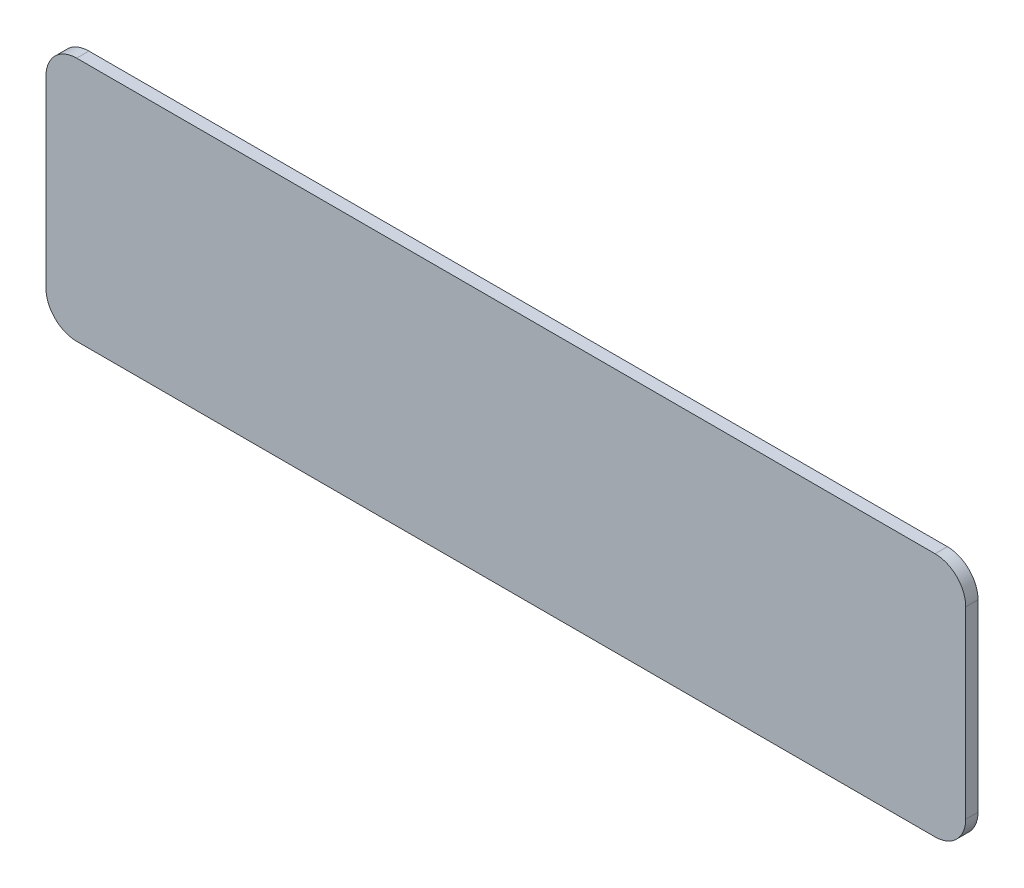
ISO-10303-21;
HEADER;
FILE_DESCRIPTION(('STEP AP214'),'2;1');
FILE_NAME('part.step','',(''),(''),'','','');
FILE_SCHEMA(('AUTOMOTIVE_DESIGN { 1 0 10303 214 1 1 1 1 }'));
ENDSEC;
DATA;
#1=APPLICATION_CONTEXT('core data for automotive mechanical design processes');
#2=APPLICATION_PROTOCOL_DEFINITION('international standard','automotive_design',2000,#1);
#3=PRODUCT_CONTEXT('',#1,'mechanical');
#4=PRODUCT('Part','Part','',(#3));
#5=PRODUCT_RELATED_PRODUCT_CATEGORY('part','',(#4));
#6=PRODUCT_DEFINITION_FORMATION('','',#4);
#7=PRODUCT_DEFINITION_CONTEXT('part definition',#1,'design');
#8=PRODUCT_DEFINITION('design','',#6,#7);
#9=PRODUCT_DEFINITION_SHAPE('','',#8);
#10=(LENGTH_UNIT() NAMED_UNIT(*) SI_UNIT(.MILLI.,.METRE.));
#11=(NAMED_UNIT(*) PLANE_ANGLE_UNIT() SI_UNIT($,.RADIAN.));
#12=(NAMED_UNIT(*) SI_UNIT($,.STERADIAN.) SOLID_ANGLE_UNIT());
#13=UNCERTAINTY_MEASURE_WITH_UNIT(LENGTH_MEASURE(1.E-05),#10,'distance_accuracy_value','');
#14=(GEOMETRIC_REPRESENTATION_CONTEXT(3) GLOBAL_UNCERTAINTY_ASSIGNED_CONTEXT((#13)) GLOBAL_UNIT_ASSIGNED_CONTEXT((#10,
#11,#12)) REPRESENTATION_CONTEXT('',''));
#15=CARTESIAN_POINT('',(0.,0.,0.));
#16=DIRECTION('',(0.,0.,1.));
#17=DIRECTION('',(1.,0.,0.));
#18=AXIS2_PLACEMENT_3D('',#15,#16,#17);
#19=CARTESIAN_POINT('',(80.5012762868845,0.,1.));
#20=DIRECTION('',(-1.,0.,0.));
#21=DIRECTION('',(0.,0.,1.));
#22=AXIS2_PLACEMENT_3D('',#19,#20,#21);
#23=PLANE('',#22);
#24=DIRECTION('',(0.,1.,0.));
#25=VECTOR('',#24,1.);
#26=CARTESIAN_POINT('',(80.5012762868845,0.,-1.));
#27=LINE('',#26,#25);
#28=CARTESIAN_POINT('',(80.5012762868845,-14.1165005815671,-1.));
#29=VERTEX_POINT('',#28);
#30=CARTESIAN_POINT('',(80.5012762868845,15.8834994184329,-1.));
#31=VERTEX_POINT('',#30);
#32=EDGE_CURVE('E134',#29,#31,#27,.T.);
#33=ORIENTED_EDGE('',*,*,#32,.T.);
#34=DIRECTION('',(0.,0.,-1.));
#35=VECTOR('',#34,1.);
#36=CARTESIAN_POINT('',(80.5012762868845,15.8834994184329,1.));
#37=LINE('',#36,#35);
#38=CARTESIAN_POINT('',(80.5012762868845,15.8834994184329,1.));
#39=VERTEX_POINT('',#38);
#40=EDGE_CURVE('E11',#39,#31,#37,.T.);
#41=ORIENTED_EDGE('',*,*,#40,.F.);
#42=DIRECTION('',(0.,1.,0.));
#43=VECTOR('',#42,1.);
#44=CARTESIAN_POINT('',(80.5012762868845,0.,1.));
#45=LINE('',#44,#43);
#46=CARTESIAN_POINT('',(80.5012762868845,-14.1165005815671,1.));
#47=VERTEX_POINT('',#46);
#48=EDGE_CURVE('E154',#47,#39,#45,.T.);
#49=ORIENTED_EDGE('',*,*,#48,.F.);
#50=DIRECTION('',(0.,0.,-1.));
#51=VECTOR('',#50,1.);
#52=CARTESIAN_POINT('',(80.5012762868845,-14.1165005815671,1.));
#53=LINE('',#52,#51);
#54=EDGE_CURVE('E53',#47,#29,#53,.T.);
#55=ORIENTED_EDGE('',*,*,#54,.T.);
#56=EDGE_LOOP('',(#33,#41,#49,#55));
#57=FACE_BOUND('',#56,.T.);
#58=ADVANCED_FACE('F37',(#57),#23,.F.);
#59=CARTESIAN_POINT('',(75.5012762868844,15.8834994184329,1.));
#60=DIRECTION('',(0.,0.,-1.));
#61=DIRECTION('',(-1.,0.,0.));
#62=AXIS2_PLACEMENT_3D('',#59,#60,#61);
#63=CYLINDRICAL_SURFACE('',#62,5.);
#64=CARTESIAN_POINT('',(75.5012762868844,15.8834994184329,-1.));
#65=DIRECTION('',(0.,0.,1.));
#66=DIRECTION('',(1.,0.,0.));
#67=AXIS2_PLACEMENT_3D('',#64,#65,#66);
#68=CIRCLE('',#67,5.);
#69=CARTESIAN_POINT('',(75.5012762868844,20.8834994184329,-1.));
#70=VERTEX_POINT('',#69);
#71=EDGE_CURVE('E136',#31,#70,#68,.T.);
#72=ORIENTED_EDGE('',*,*,#71,.T.);
#73=DIRECTION('',(0.,0.,-1.));
#74=VECTOR('',#73,1.);
#75=CARTESIAN_POINT('',(75.5012762868844,20.8834994184329,1.));
#76=LINE('',#75,#74);
#77=CARTESIAN_POINT('',(75.5012762868844,20.8834994184329,1.));
#78=VERTEX_POINT('',#77);
#79=EDGE_CURVE('E45',#78,#70,#76,.T.);
#80=ORIENTED_EDGE('',*,*,#79,.F.);
#81=CARTESIAN_POINT('',(75.5012762868844,15.8834994184329,1.));
#82=DIRECTION('',(0.,0.,1.));
#83=DIRECTION('',(1.,0.,0.));
#84=AXIS2_PLACEMENT_3D('',#81,#82,#83);
#85=CIRCLE('',#84,5.);
#86=EDGE_CURVE('E91',#39,#78,#85,.T.);
#87=ORIENTED_EDGE('',*,*,#86,.F.);
#88=ORIENTED_EDGE('',*,*,#40,.T.);
#89=EDGE_LOOP('',(#72,#80,#87,#88));
#90=FACE_BOUND('',#89,.T.);
#91=ADVANCED_FACE('F167',(#90),#63,.T.);
#92=CARTESIAN_POINT('',(0.,20.8834994184329,1.));
#93=DIRECTION('',(0.,1.,0.));
#94=DIRECTION('',(0.,0.,1.));
#95=AXIS2_PLACEMENT_3D('',#92,#93,#94);
#96=PLANE('',#95);
#97=DIRECTION('',(1.,0.,0.));
#98=VECTOR('',#97,1.);
#99=CARTESIAN_POINT('',(0.,20.8834994184329,-1.));
#100=LINE('',#99,#98);
#101=CARTESIAN_POINT('',(-64.4987237131155,20.8834994184329,-1.));
#102=VERTEX_POINT('',#101);
#103=EDGE_CURVE('E139',#102,#70,#100,.T.);
#104=ORIENTED_EDGE('',*,*,#103,.F.);
#105=DIRECTION('',(0.,0.,-1.));
#106=VECTOR('',#105,1.);
#107=CARTESIAN_POINT('',(-64.4987237131155,20.8834994184329,1.));
#108=LINE('',#107,#106);
#109=CARTESIAN_POINT('',(-64.4987237131155,20.8834994184329,1.));
#110=VERTEX_POINT('',#109);
#111=EDGE_CURVE('E160',#110,#102,#108,.T.);
#112=ORIENTED_EDGE('',*,*,#111,.F.);
#113=DIRECTION('',(1.,0.,0.));
#114=VECTOR('',#113,1.);
#115=CARTESIAN_POINT('',(0.,20.8834994184329,1.));
#116=LINE('',#115,#114);
#117=EDGE_CURVE('E166',#110,#78,#116,.T.);
#118=ORIENTED_EDGE('',*,*,#117,.T.);
#119=ORIENTED_EDGE('',*,*,#79,.T.);
#120=EDGE_LOOP('',(#104,#112,#118,#119));
#121=FACE_BOUND('',#120,.T.);
#122=ADVANCED_FACE('F164',(#121),#96,.T.);
#123=CARTESIAN_POINT('',(-64.4987237131155,15.8834994184329,1.));
#124=DIRECTION('',(0.,0.,-1.));
#125=DIRECTION('',(-1.,0.,0.));
#126=AXIS2_PLACEMENT_3D('',#123,#124,#125);
#127=CYLINDRICAL_SURFACE('',#126,5.);
#128=CARTESIAN_POINT('',(-64.4987237131155,15.8834994184329,-1.));
#129=DIRECTION('',(0.,0.,1.));
#130=DIRECTION('',(1.,0.,0.));
#131=AXIS2_PLACEMENT_3D('',#128,#129,#130);
#132=CIRCLE('',#131,5.);
#133=CARTESIAN_POINT('',(-69.4987237131155,15.8834994184329,-1.));
#134=VERTEX_POINT('',#133);
#135=EDGE_CURVE('E142',#134,#102,#132,.F.);
#136=ORIENTED_EDGE('',*,*,#135,.F.);
#137=DIRECTION('',(0.,0.,-1.));
#138=VECTOR('',#137,1.);
#139=CARTESIAN_POINT('',(-69.4987237131155,15.8834994184329,1.));
#140=LINE('',#139,#138);
#141=CARTESIAN_POINT('',(-69.4987237131155,15.8834994184329,1.));
#142=VERTEX_POINT('',#141);
#143=EDGE_CURVE('E158',#142,#134,#140,.T.);
#144=ORIENTED_EDGE('',*,*,#143,.F.);
#145=CARTESIAN_POINT('',(-64.4987237131155,15.8834994184329,1.));
#146=DIRECTION('',(0.,0.,1.));
#147=DIRECTION('',(1.,0.,0.));
#148=AXIS2_PLACEMENT_3D('',#145,#146,#147);
#149=CIRCLE('',#148,5.);
#150=EDGE_CURVE('E176',#142,#110,#149,.F.);
#151=ORIENTED_EDGE('',*,*,#150,.T.);
#152=ORIENTED_EDGE('',*,*,#111,.T.);
#153=EDGE_LOOP('',(#136,#144,#151,#152));
#154=FACE_BOUND('',#153,.T.);
#155=ADVANCED_FACE('F174',(#154),#127,.T.);
#156=CARTESIAN_POINT('',(-69.4987237131155,0.,1.));
#157=DIRECTION('',(-1.,0.,0.));
#158=DIRECTION('',(0.,0.,1.));
#159=AXIS2_PLACEMENT_3D('',#156,#157,#158);
#160=PLANE('',#159);
#161=DIRECTION('',(0.,1.,0.));
#162=VECTOR('',#161,1.);
#163=CARTESIAN_POINT('',(-69.4987237131155,0.,-1.));
#164=LINE('',#163,#162);
#165=CARTESIAN_POINT('',(-69.4987237131155,-14.1165005815671,-1.));
#166=VERTEX_POINT('',#165);
#167=EDGE_CURVE('E145',#166,#134,#164,.T.);
#168=ORIENTED_EDGE('',*,*,#167,.F.);
#169=DIRECTION('',(0.,0.,-1.));
#170=VECTOR('',#169,1.);
#171=CARTESIAN_POINT('',(-69.4987237131155,-14.1165005815671,1.));
#172=LINE('',#171,#170);
#173=CARTESIAN_POINT('',(-69.4987237131155,-14.1165005815671,1.));
#174=VERTEX_POINT('',#173);
#175=EDGE_CURVE('E116',#174,#166,#172,.T.);
#176=ORIENTED_EDGE('',*,*,#175,.F.);
#177=DIRECTION('',(0.,1.,0.));
#178=VECTOR('',#177,1.);
#179=CARTESIAN_POINT('',(-69.4987237131155,0.,1.));
#180=LINE('',#179,#178);
#181=EDGE_CURVE('E126',#174,#142,#180,.T.);
#182=ORIENTED_EDGE('',*,*,#181,.T.);
#183=ORIENTED_EDGE('',*,*,#143,.T.);
#184=EDGE_LOOP('',(#168,#176,#182,#183));
#185=FACE_BOUND('',#184,.T.);
#186=ADVANCED_FACE('F182',(#185),#160,.T.);
#187=CARTESIAN_POINT('',(-64.4987237131155,-14.1165005815671,1.));
#188=DIRECTION('',(0.,0.,-1.));
#189=DIRECTION('',(-1.,0.,0.));
#190=AXIS2_PLACEMENT_3D('',#187,#188,#189);
#191=CYLINDRICAL_SURFACE('',#190,5.);
#192=CARTESIAN_POINT('',(-64.4987237131155,-14.1165005815671,-1.));
#193=DIRECTION('',(0.,0.,1.));
#194=DIRECTION('',(1.,0.,0.));
#195=AXIS2_PLACEMENT_3D('',#192,#193,#194);
#196=CIRCLE('',#195,5.);
#197=CARTESIAN_POINT('',(-64.4987237131155,-19.1165005815671,-1.));
#198=VERTEX_POINT('',#197);
#199=EDGE_CURVE('E112',#198,#166,#196,.F.);
#200=ORIENTED_EDGE('',*,*,#199,.F.);
#201=DIRECTION('',(0.,0.,-1.));
#202=VECTOR('',#201,1.);
#203=CARTESIAN_POINT('',(-64.4987237131155,-19.1165005815671,1.));
#204=LINE('',#203,#202);
#205=CARTESIAN_POINT('',(-64.4987237131155,-19.1165005815671,1.));
#206=VERTEX_POINT('',#205);
#207=EDGE_CURVE('E107',#206,#198,#204,.T.);
#208=ORIENTED_EDGE('',*,*,#207,.F.);
#209=CARTESIAN_POINT('',(-64.4987237131155,-14.1165005815671,1.));
#210=DIRECTION('',(0.,0.,1.));
#211=DIRECTION('',(1.,0.,0.));
#212=AXIS2_PLACEMENT_3D('',#209,#210,#211);
#213=CIRCLE('',#212,5.);
#214=EDGE_CURVE('E110',#206,#174,#213,.F.);
#215=ORIENTED_EDGE('',*,*,#214,.T.);
#216=ORIENTED_EDGE('',*,*,#175,.T.);
#217=EDGE_LOOP('',(#200,#208,#215,#216));
#218=FACE_BOUND('',#217,.T.);
#219=ADVANCED_FACE('F109',(#218),#191,.T.);
#220=CARTESIAN_POINT('',(0.,-19.1165005815671,1.));
#221=DIRECTION('',(0.,-1.,0.));
#222=DIRECTION('',(0.,0.,-1.));
#223=AXIS2_PLACEMENT_3D('',#220,#221,#222);
#224=PLANE('',#223);
#225=DIRECTION('',(-1.,0.,0.));
#226=VECTOR('',#225,1.);
#227=CARTESIAN_POINT('',(0.,-19.1165005815671,-1.));
#228=LINE('',#227,#226);
#229=CARTESIAN_POINT('',(75.5012762868844,-19.1165005815671,-1.));
#230=VERTEX_POINT('',#229);
#231=EDGE_CURVE('E149',#230,#198,#228,.T.);
#232=ORIENTED_EDGE('',*,*,#231,.F.);
#233=DIRECTION('',(0.,0.,-1.));
#234=VECTOR('',#233,1.);
#235=CARTESIAN_POINT('',(75.5012762868844,-19.1165005815671,1.));
#236=LINE('',#235,#234);
#237=CARTESIAN_POINT('',(75.5012762868844,-19.1165005815671,1.));
#238=VERTEX_POINT('',#237);
#239=EDGE_CURVE('E79',#238,#230,#236,.T.);
#240=ORIENTED_EDGE('',*,*,#239,.F.);
#241=DIRECTION('',(-1.,0.,0.));
#242=VECTOR('',#241,1.);
#243=CARTESIAN_POINT('',(0.,-19.1165005815671,1.));
#244=LINE('',#243,#242);
#245=EDGE_CURVE('E123',#238,#206,#244,.T.);
#246=ORIENTED_EDGE('',*,*,#245,.T.);
#247=ORIENTED_EDGE('',*,*,#207,.T.);
#248=EDGE_LOOP('',(#232,#240,#246,#247));
#249=FACE_BOUND('',#248,.T.);
#250=ADVANCED_FACE('F128',(#249),#224,.T.);
#251=CARTESIAN_POINT('',(75.5012762868844,-14.1165005815671,1.));
#252=DIRECTION('',(0.,0.,-1.));
#253=DIRECTION('',(-1.,0.,0.));
#254=AXIS2_PLACEMENT_3D('',#251,#252,#253);
#255=CYLINDRICAL_SURFACE('',#254,5.);
#256=CARTESIAN_POINT('',(75.5012762868844,-14.1165005815671,-1.));
#257=DIRECTION('',(0.,0.,1.));
#258=DIRECTION('',(1.,0.,0.));
#259=AXIS2_PLACEMENT_3D('',#256,#257,#258);
#260=CIRCLE('',#259,5.);
#261=EDGE_CURVE('E151',#29,#230,#260,.F.);
#262=ORIENTED_EDGE('',*,*,#261,.F.);
#263=ORIENTED_EDGE('',*,*,#54,.F.);
#264=CARTESIAN_POINT('',(75.5012762868844,-14.1165005815671,1.));
#265=DIRECTION('',(0.,0.,1.));
#266=DIRECTION('',(1.,0.,0.));
#267=AXIS2_PLACEMENT_3D('',#264,#265,#266);
#268=CIRCLE('',#267,5.);
#269=EDGE_CURVE('E129',#47,#238,#268,.F.);
#270=ORIENTED_EDGE('',*,*,#269,.T.);
#271=ORIENTED_EDGE('',*,*,#239,.T.);
#272=EDGE_LOOP('',(#262,#263,#270,#271));
#273=FACE_BOUND('',#272,.T.);
#274=ADVANCED_FACE('F183',(#273),#255,.T.);
#275=CARTESIAN_POINT('',(0.,0.,1.));
#276=DIRECTION('',(0.,0.,1.));
#277=DIRECTION('',(1.,0.,0.));
#278=AXIS2_PLACEMENT_3D('',#275,#276,#277);
#279=PLANE('',#278);
#280=ORIENTED_EDGE('',*,*,#48,.T.);
#281=ORIENTED_EDGE('',*,*,#86,.T.);
#282=ORIENTED_EDGE('',*,*,#117,.F.);
#283=ORIENTED_EDGE('',*,*,#150,.F.);
#284=ORIENTED_EDGE('',*,*,#181,.F.);
#285=ORIENTED_EDGE('',*,*,#214,.F.);
#286=ORIENTED_EDGE('',*,*,#245,.F.);
#287=ORIENTED_EDGE('',*,*,#269,.F.);
#288=EDGE_LOOP('',(#280,#281,#282,#283,#284,#285,#286,#287));
#289=FACE_BOUND('',#288,.T.);
#290=ADVANCED_FACE('F121',(#289),#279,.T.);
#291=CARTESIAN_POINT('',(0.,0.,-1.));
#292=DIRECTION('',(0.,0.,1.));
#293=DIRECTION('',(1.,0.,0.));
#294=AXIS2_PLACEMENT_3D('',#291,#292,#293);
#295=PLANE('',#294);
#296=ORIENTED_EDGE('',*,*,#32,.F.);
#297=ORIENTED_EDGE('',*,*,#261,.T.);
#298=ORIENTED_EDGE('',*,*,#231,.T.);
#299=ORIENTED_EDGE('',*,*,#199,.T.);
#300=ORIENTED_EDGE('',*,*,#167,.T.);
#301=ORIENTED_EDGE('',*,*,#135,.T.);
#302=ORIENTED_EDGE('',*,*,#103,.T.);
#303=ORIENTED_EDGE('',*,*,#71,.F.);
#304=EDGE_LOOP('',(#296,#297,#298,#299,#300,#301,#302,#303));
#305=FACE_BOUND('',#304,.T.);
#306=ADVANCED_FACE('F170',(#305),#295,.F.);
#307=CLOSED_SHELL('',(#58,#91,#122,#155,#186,#219,#250,#274,#290,#306));
#308=MANIFOLD_SOLID_BREP('B2',#307);
#309=ADVANCED_BREP_SHAPE_REPRESENTATION('',(#18,#308),#14);
#310=SHAPE_DEFINITION_REPRESENTATION(#9,#309);
ENDSEC;
END-ISO-10303-21;
